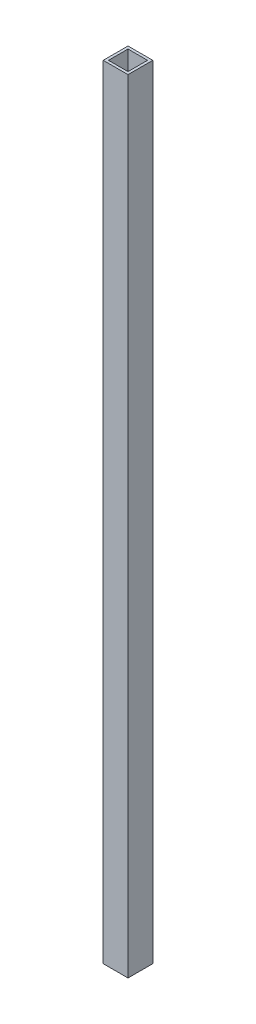
ISO-10303-21;
HEADER;
FILE_DESCRIPTION(('STEP AP214'),'2;1');
FILE_NAME('part.step','',(''),(''),'','','');
FILE_SCHEMA(('AUTOMOTIVE_DESIGN { 1 0 10303 214 1 1 1 1 }'));
ENDSEC;
DATA;
#1=APPLICATION_CONTEXT('core data for automotive mechanical design processes');
#2=APPLICATION_PROTOCOL_DEFINITION('international standard','automotive_design',2000,#1);
#3=PRODUCT_CONTEXT('',#1,'mechanical');
#4=PRODUCT('Part','Part','',(#3));
#5=PRODUCT_RELATED_PRODUCT_CATEGORY('part','',(#4));
#6=PRODUCT_DEFINITION_FORMATION('','',#4);
#7=PRODUCT_DEFINITION_CONTEXT('part definition',#1,'design');
#8=PRODUCT_DEFINITION('design','',#6,#7);
#9=PRODUCT_DEFINITION_SHAPE('','',#8);
#10=(LENGTH_UNIT() NAMED_UNIT(*) SI_UNIT(.MILLI.,.METRE.));
#11=(NAMED_UNIT(*) PLANE_ANGLE_UNIT() SI_UNIT($,.RADIAN.));
#12=(NAMED_UNIT(*) SI_UNIT($,.STERADIAN.) SOLID_ANGLE_UNIT());
#13=UNCERTAINTY_MEASURE_WITH_UNIT(LENGTH_MEASURE(1.E-05),#10,'distance_accuracy_value','');
#14=(GEOMETRIC_REPRESENTATION_CONTEXT(3) GLOBAL_UNCERTAINTY_ASSIGNED_CONTEXT((#13)) GLOBAL_UNIT_ASSIGNED_CONTEXT((#10,
#11,#12)) REPRESENTATION_CONTEXT('',''));
#15=CARTESIAN_POINT('',(0.,0.,0.));
#16=DIRECTION('',(0.,0.,1.));
#17=DIRECTION('',(1.,0.,0.));
#18=AXIS2_PLACEMENT_3D('',#15,#16,#17);
#19=CARTESIAN_POINT('',(0.,600.,0.));
#20=DIRECTION('',(0.,1.,0.));
#21=DIRECTION('',(0.,0.,1.));
#22=AXIS2_PLACEMENT_3D('',#19,#20,#21);
#23=PLANE('',#22);
#24=DIRECTION('',(0.,0.,-1.));
#25=VECTOR('',#24,1.);
#26=CARTESIAN_POINT('',(9.5,600.,9.5));
#27=LINE('',#26,#25);
#28=CARTESIAN_POINT('',(9.5,600.,9.5));
#29=VERTEX_POINT('',#28);
#30=CARTESIAN_POINT('',(9.5,600.,-9.5));
#31=VERTEX_POINT('',#30);
#32=EDGE_CURVE('E162',#29,#31,#27,.T.);
#33=ORIENTED_EDGE('',*,*,#32,.T.);
#34=DIRECTION('',(-1.,0.,0.));
#35=VECTOR('',#34,1.);
#36=CARTESIAN_POINT('',(-9.5,600.,-9.5));
#37=LINE('',#36,#35);
#38=CARTESIAN_POINT('',(-9.5,600.,-9.5));
#39=VERTEX_POINT('',#38);
#40=EDGE_CURVE('E165',#31,#39,#37,.T.);
#41=ORIENTED_EDGE('',*,*,#40,.T.);
#42=DIRECTION('',(0.,0.,1.));
#43=VECTOR('',#42,1.);
#44=CARTESIAN_POINT('',(-9.5,600.,9.5));
#45=LINE('',#44,#43);
#46=CARTESIAN_POINT('',(-9.5,600.,9.5));
#47=VERTEX_POINT('',#46);
#48=EDGE_CURVE('E168',#39,#47,#45,.T.);
#49=ORIENTED_EDGE('',*,*,#48,.T.);
#50=DIRECTION('',(1.,0.,0.));
#51=VECTOR('',#50,1.);
#52=CARTESIAN_POINT('',(-9.5,600.,9.5));
#53=LINE('',#52,#51);
#54=EDGE_CURVE('E170',#47,#29,#53,.T.);
#55=ORIENTED_EDGE('',*,*,#54,.T.);
#56=EDGE_LOOP('',(#33,#41,#49,#55));
#57=FACE_BOUND('',#56,.T.);
#58=DIRECTION('',(-1.,0.,0.));
#59=VECTOR('',#58,1.);
#60=CARTESIAN_POINT('',(0.,600.,-7.5));
#61=LINE('',#60,#59);
#62=CARTESIAN_POINT('',(7.5,600.,-7.5));
#63=VERTEX_POINT('',#62);
#64=CARTESIAN_POINT('',(-7.5,600.,-7.5));
#65=VERTEX_POINT('',#64);
#66=EDGE_CURVE('E134',#63,#65,#61,.T.);
#67=ORIENTED_EDGE('',*,*,#66,.F.);
#68=DIRECTION('',(0.,0.,-1.));
#69=VECTOR('',#68,1.);
#70=CARTESIAN_POINT('',(7.5,600.,0.));
#71=LINE('',#70,#69);
#72=CARTESIAN_POINT('',(7.5,600.,7.5));
#73=VERTEX_POINT('',#72);
#74=EDGE_CURVE('E126',#73,#63,#71,.T.);
#75=ORIENTED_EDGE('',*,*,#74,.F.);
#76=DIRECTION('',(1.,0.,0.));
#77=VECTOR('',#76,1.);
#78=CARTESIAN_POINT('',(0.,600.,7.5));
#79=LINE('',#78,#77);
#80=CARTESIAN_POINT('',(-7.5,600.,7.5));
#81=VERTEX_POINT('',#80);
#82=EDGE_CURVE('E148',#81,#73,#79,.T.);
#83=ORIENTED_EDGE('',*,*,#82,.F.);
#84=DIRECTION('',(0.,0.,1.));
#85=VECTOR('',#84,1.);
#86=CARTESIAN_POINT('',(-7.5,600.,0.));
#87=LINE('',#86,#85);
#88=EDGE_CURVE('E146',#65,#81,#87,.T.);
#89=ORIENTED_EDGE('',*,*,#88,.F.);
#90=EDGE_LOOP('',(#67,#75,#83,#89));
#91=FACE_BOUND('',#90,.T.);
#92=ADVANCED_FACE('F61',(#57,#91),#23,.T.);
#93=CARTESIAN_POINT('',(0.,0.,0.));
#94=DIRECTION('',(0.,1.,0.));
#95=DIRECTION('',(0.,0.,1.));
#96=AXIS2_PLACEMENT_3D('',#93,#94,#95);
#97=PLANE('',#96);
#98=DIRECTION('',(0.,0.,-1.));
#99=VECTOR('',#98,1.);
#100=CARTESIAN_POINT('',(9.5,0.,9.5));
#101=LINE('',#100,#99);
#102=CARTESIAN_POINT('',(9.5,0.,9.5));
#103=VERTEX_POINT('',#102);
#104=CARTESIAN_POINT('',(9.5,0.,-9.5));
#105=VERTEX_POINT('',#104);
#106=EDGE_CURVE('E142',#103,#105,#101,.T.);
#107=ORIENTED_EDGE('',*,*,#106,.F.);
#108=DIRECTION('',(1.,0.,0.));
#109=VECTOR('',#108,1.);
#110=CARTESIAN_POINT('',(-9.5,0.,9.5));
#111=LINE('',#110,#109);
#112=CARTESIAN_POINT('',(-9.5,0.,9.5));
#113=VERTEX_POINT('',#112);
#114=EDGE_CURVE('E166',#113,#103,#111,.T.);
#115=ORIENTED_EDGE('',*,*,#114,.F.);
#116=DIRECTION('',(0.,0.,1.));
#117=VECTOR('',#116,1.);
#118=CARTESIAN_POINT('',(-9.5,0.,9.5));
#119=LINE('',#118,#117);
#120=CARTESIAN_POINT('',(-9.5,0.,-9.5));
#121=VERTEX_POINT('',#120);
#122=EDGE_CURVE('E177',#121,#113,#119,.T.);
#123=ORIENTED_EDGE('',*,*,#122,.F.);
#124=DIRECTION('',(-1.,0.,0.));
#125=VECTOR('',#124,1.);
#126=CARTESIAN_POINT('',(-9.5,0.,-9.5));
#127=LINE('',#126,#125);
#128=EDGE_CURVE('E175',#105,#121,#127,.T.);
#129=ORIENTED_EDGE('',*,*,#128,.F.);
#130=EDGE_LOOP('',(#107,#115,#123,#129));
#131=FACE_BOUND('',#130,.T.);
#132=DIRECTION('',(0.,0.,-1.));
#133=VECTOR('',#132,1.);
#134=CARTESIAN_POINT('',(7.5,0.,0.));
#135=LINE('',#134,#133);
#136=CARTESIAN_POINT('',(7.5,0.,7.5));
#137=VERTEX_POINT('',#136);
#138=CARTESIAN_POINT('',(7.5,0.,-7.5));
#139=VERTEX_POINT('',#138);
#140=EDGE_CURVE('E84',#137,#139,#135,.T.);
#141=ORIENTED_EDGE('',*,*,#140,.T.);
#142=DIRECTION('',(-1.,0.,0.));
#143=VECTOR('',#142,1.);
#144=CARTESIAN_POINT('',(0.,0.,-7.5));
#145=LINE('',#144,#143);
#146=CARTESIAN_POINT('',(-7.5,0.,-7.5));
#147=VERTEX_POINT('',#146);
#148=EDGE_CURVE('E141',#139,#147,#145,.T.);
#149=ORIENTED_EDGE('',*,*,#148,.T.);
#150=DIRECTION('',(0.,0.,1.));
#151=VECTOR('',#150,1.);
#152=CARTESIAN_POINT('',(-7.5,0.,0.));
#153=LINE('',#152,#151);
#154=CARTESIAN_POINT('',(-7.5,0.,7.5));
#155=VERTEX_POINT('',#154);
#156=EDGE_CURVE('E154',#147,#155,#153,.T.);
#157=ORIENTED_EDGE('',*,*,#156,.T.);
#158=DIRECTION('',(1.,0.,0.));
#159=VECTOR('',#158,1.);
#160=CARTESIAN_POINT('',(0.,0.,7.5));
#161=LINE('',#160,#159);
#162=EDGE_CURVE('E135',#155,#137,#161,.T.);
#163=ORIENTED_EDGE('',*,*,#162,.T.);
#164=EDGE_LOOP('',(#141,#149,#157,#163));
#165=FACE_BOUND('',#164,.T.);
#166=ADVANCED_FACE('F195',(#131,#165),#97,.F.);
#167=CARTESIAN_POINT('',(9.5,600.,9.5));
#168=DIRECTION('',(-1.,0.,0.));
#169=DIRECTION('',(0.,0.,1.));
#170=AXIS2_PLACEMENT_3D('',#167,#168,#169);
#171=PLANE('',#170);
#172=ORIENTED_EDGE('',*,*,#106,.T.);
#173=DIRECTION('',(0.,-1.,0.));
#174=VECTOR('',#173,1.);
#175=CARTESIAN_POINT('',(9.5,600.,-9.5));
#176=LINE('',#175,#174);
#177=EDGE_CURVE('E12',#31,#105,#176,.T.);
#178=ORIENTED_EDGE('',*,*,#177,.F.);
#179=ORIENTED_EDGE('',*,*,#32,.F.);
#180=DIRECTION('',(0.,-1.,0.));
#181=VECTOR('',#180,1.);
#182=CARTESIAN_POINT('',(9.5,600.,9.5));
#183=LINE('',#182,#181);
#184=EDGE_CURVE('E172',#29,#103,#183,.T.);
#185=ORIENTED_EDGE('',*,*,#184,.T.);
#186=EDGE_LOOP('',(#172,#178,#179,#185));
#187=FACE_BOUND('',#186,.T.);
#188=ADVANCED_FACE('F63',(#187),#171,.F.);
#189=CARTESIAN_POINT('',(-9.5,600.,-9.5));
#190=DIRECTION('',(0.,0.,1.));
#191=DIRECTION('',(1.,0.,0.));
#192=AXIS2_PLACEMENT_3D('',#189,#190,#191);
#193=PLANE('',#192);
#194=ORIENTED_EDGE('',*,*,#128,.T.);
#195=DIRECTION('',(0.,-1.,0.));
#196=VECTOR('',#195,1.);
#197=CARTESIAN_POINT('',(-9.5,600.,-9.5));
#198=LINE('',#197,#196);
#199=EDGE_CURVE('E69',#39,#121,#198,.T.);
#200=ORIENTED_EDGE('',*,*,#199,.F.);
#201=ORIENTED_EDGE('',*,*,#40,.F.);
#202=ORIENTED_EDGE('',*,*,#177,.T.);
#203=EDGE_LOOP('',(#194,#200,#201,#202));
#204=FACE_BOUND('',#203,.T.);
#205=ADVANCED_FACE('F205',(#204),#193,.F.);
#206=CARTESIAN_POINT('',(-9.5,600.,9.5));
#207=DIRECTION('',(1.,0.,0.));
#208=DIRECTION('',(0.,0.,-1.));
#209=AXIS2_PLACEMENT_3D('',#206,#207,#208);
#210=PLANE('',#209);
#211=ORIENTED_EDGE('',*,*,#122,.T.);
#212=DIRECTION('',(0.,-1.,0.));
#213=VECTOR('',#212,1.);
#214=CARTESIAN_POINT('',(-9.5,600.,9.5));
#215=LINE('',#214,#213);
#216=EDGE_CURVE('E182',#47,#113,#215,.T.);
#217=ORIENTED_EDGE('',*,*,#216,.F.);
#218=ORIENTED_EDGE('',*,*,#48,.F.);
#219=ORIENTED_EDGE('',*,*,#199,.T.);
#220=EDGE_LOOP('',(#211,#217,#218,#219));
#221=FACE_BOUND('',#220,.T.);
#222=ADVANCED_FACE('F189',(#221),#210,.F.);
#223=CARTESIAN_POINT('',(-9.5,600.,9.5));
#224=DIRECTION('',(0.,0.,-1.));
#225=DIRECTION('',(-1.,0.,0.));
#226=AXIS2_PLACEMENT_3D('',#223,#224,#225);
#227=PLANE('',#226);
#228=ORIENTED_EDGE('',*,*,#114,.T.);
#229=ORIENTED_EDGE('',*,*,#184,.F.);
#230=ORIENTED_EDGE('',*,*,#54,.F.);
#231=ORIENTED_EDGE('',*,*,#216,.T.);
#232=EDGE_LOOP('',(#228,#229,#230,#231));
#233=FACE_BOUND('',#232,.T.);
#234=ADVANCED_FACE('F199',(#233),#227,.F.);
#235=CARTESIAN_POINT('',(7.5,600.,0.));
#236=DIRECTION('',(-1.,0.,0.));
#237=DIRECTION('',(0.,0.,1.));
#238=AXIS2_PLACEMENT_3D('',#235,#236,#237);
#239=PLANE('',#238);
#240=ORIENTED_EDGE('',*,*,#140,.F.);
#241=DIRECTION('',(0.,-1.,0.));
#242=VECTOR('',#241,1.);
#243=CARTESIAN_POINT('',(7.5,600.,7.5));
#244=LINE('',#243,#242);
#245=EDGE_CURVE('E130',#73,#137,#244,.T.);
#246=ORIENTED_EDGE('',*,*,#245,.F.);
#247=ORIENTED_EDGE('',*,*,#74,.T.);
#248=DIRECTION('',(0.,-1.,0.));
#249=VECTOR('',#248,1.);
#250=CARTESIAN_POINT('',(7.5,600.,-7.5));
#251=LINE('',#250,#249);
#252=EDGE_CURVE('E129',#63,#139,#251,.T.);
#253=ORIENTED_EDGE('',*,*,#252,.T.);
#254=EDGE_LOOP('',(#240,#246,#247,#253));
#255=FACE_BOUND('',#254,.T.);
#256=ADVANCED_FACE('F128',(#255),#239,.T.);
#257=CARTESIAN_POINT('',(0.,600.,-7.5));
#258=DIRECTION('',(0.,0.,1.));
#259=DIRECTION('',(1.,0.,0.));
#260=AXIS2_PLACEMENT_3D('',#257,#258,#259);
#261=PLANE('',#260);
#262=ORIENTED_EDGE('',*,*,#148,.F.);
#263=ORIENTED_EDGE('',*,*,#252,.F.);
#264=ORIENTED_EDGE('',*,*,#66,.T.);
#265=DIRECTION('',(0.,-1.,0.));
#266=VECTOR('',#265,1.);
#267=CARTESIAN_POINT('',(-7.5,600.,-7.5));
#268=LINE('',#267,#266);
#269=EDGE_CURVE('E143',#65,#147,#268,.T.);
#270=ORIENTED_EDGE('',*,*,#269,.T.);
#271=EDGE_LOOP('',(#262,#263,#264,#270));
#272=FACE_BOUND('',#271,.T.);
#273=ADVANCED_FACE('F138',(#272),#261,.T.);
#274=CARTESIAN_POINT('',(-7.5,600.,0.));
#275=DIRECTION('',(1.,0.,0.));
#276=DIRECTION('',(0.,0.,-1.));
#277=AXIS2_PLACEMENT_3D('',#274,#275,#276);
#278=PLANE('',#277);
#279=ORIENTED_EDGE('',*,*,#156,.F.);
#280=ORIENTED_EDGE('',*,*,#269,.F.);
#281=ORIENTED_EDGE('',*,*,#88,.T.);
#282=DIRECTION('',(0.,-1.,0.));
#283=VECTOR('',#282,1.);
#284=CARTESIAN_POINT('',(-7.5,600.,7.5));
#285=LINE('',#284,#283);
#286=EDGE_CURVE('E76',#81,#155,#285,.T.);
#287=ORIENTED_EDGE('',*,*,#286,.T.);
#288=EDGE_LOOP('',(#279,#280,#281,#287));
#289=FACE_BOUND('',#288,.T.);
#290=ADVANCED_FACE('F228',(#289),#278,.T.);
#291=CARTESIAN_POINT('',(0.,600.,7.5));
#292=DIRECTION('',(0.,0.,-1.));
#293=DIRECTION('',(-1.,0.,0.));
#294=AXIS2_PLACEMENT_3D('',#291,#292,#293);
#295=PLANE('',#294);
#296=ORIENTED_EDGE('',*,*,#162,.F.);
#297=ORIENTED_EDGE('',*,*,#286,.F.);
#298=ORIENTED_EDGE('',*,*,#82,.T.);
#299=ORIENTED_EDGE('',*,*,#245,.T.);
#300=EDGE_LOOP('',(#296,#297,#298,#299));
#301=FACE_BOUND('',#300,.T.);
#302=ADVANCED_FACE('F232',(#301),#295,.T.);
#303=CLOSED_SHELL('',(#92,#166,#188,#205,#222,#234,#256,#273,#290,#302));
#304=MANIFOLD_SOLID_BREP('B2',#303);
#305=ADVANCED_BREP_SHAPE_REPRESENTATION('',(#18,#304),#14);
#306=SHAPE_DEFINITION_REPRESENTATION(#9,#305);
ENDSEC;
END-ISO-10303-21;
